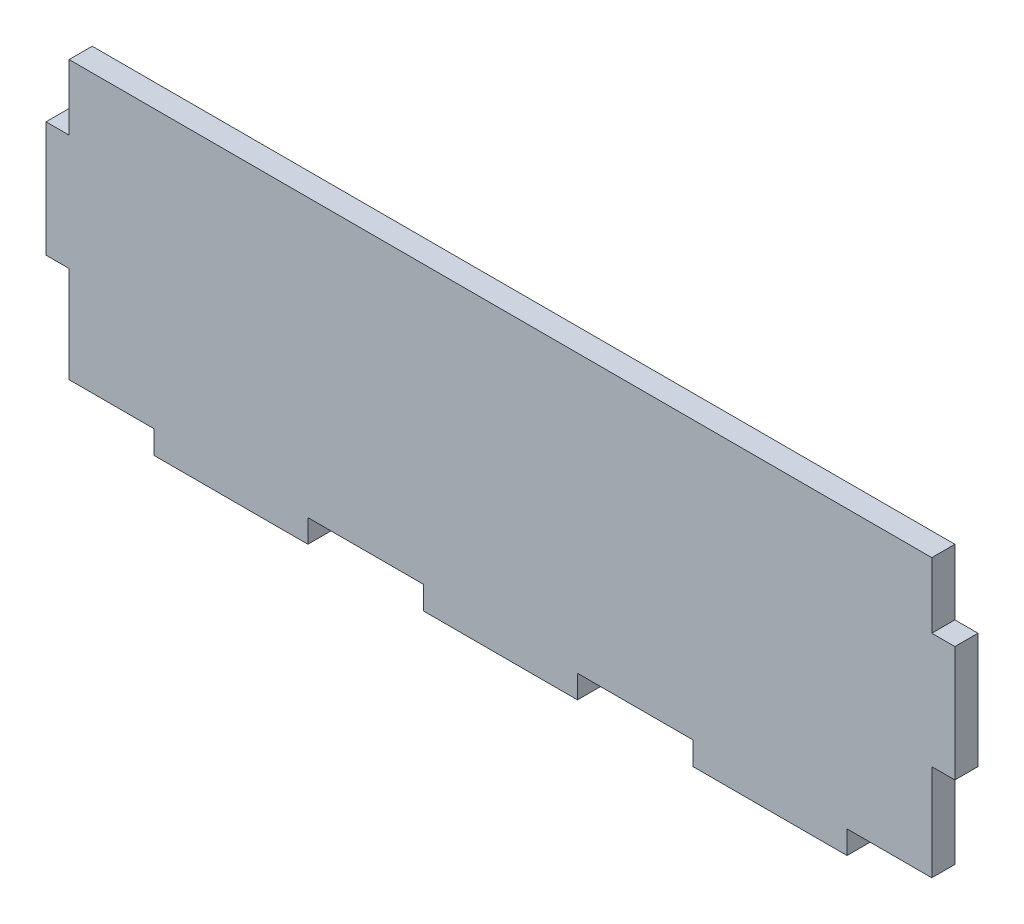
ISO-10303-21;
HEADER;
FILE_DESCRIPTION(('STEP AP214'),'2;1');
FILE_NAME('part.step','',(''),(''),'','','');
FILE_SCHEMA(('AUTOMOTIVE_DESIGN { 1 0 10303 214 1 1 1 1 }'));
ENDSEC;
DATA;
#1=APPLICATION_CONTEXT('core data for automotive mechanical design processes');
#2=APPLICATION_PROTOCOL_DEFINITION('international standard','automotive_design',2000,#1);
#3=PRODUCT_CONTEXT('',#1,'mechanical');
#4=PRODUCT('Part','Part','',(#3));
#5=PRODUCT_RELATED_PRODUCT_CATEGORY('part','',(#4));
#6=PRODUCT_DEFINITION_FORMATION('','',#4);
#7=PRODUCT_DEFINITION_CONTEXT('part definition',#1,'design');
#8=PRODUCT_DEFINITION('design','',#6,#7);
#9=PRODUCT_DEFINITION_SHAPE('','',#8);
#10=(LENGTH_UNIT() NAMED_UNIT(*) SI_UNIT(.MILLI.,.METRE.));
#11=(NAMED_UNIT(*) PLANE_ANGLE_UNIT() SI_UNIT($,.RADIAN.));
#12=(NAMED_UNIT(*) SI_UNIT($,.STERADIAN.) SOLID_ANGLE_UNIT());
#13=UNCERTAINTY_MEASURE_WITH_UNIT(LENGTH_MEASURE(1.E-05),#10,'distance_accuracy_value','');
#14=(GEOMETRIC_REPRESENTATION_CONTEXT(3) GLOBAL_UNCERTAINTY_ASSIGNED_CONTEXT((#13)) GLOBAL_UNIT_ASSIGNED_CONTEXT((#10,
#11,#12)) REPRESENTATION_CONTEXT('',''));
#15=CARTESIAN_POINT('',(0.,0.,0.));
#16=DIRECTION('',(0.,0.,1.));
#17=DIRECTION('',(1.,0.,0.));
#18=AXIS2_PLACEMENT_3D('',#15,#16,#17);
#19=CARTESIAN_POINT('',(-59.,0.,3.));
#20=DIRECTION('',(1.,0.,0.));
#21=DIRECTION('',(0.,0.,-1.));
#22=AXIS2_PLACEMENT_3D('',#19,#20,#21);
#23=PLANE('',#22);
#24=DIRECTION('',(0.,-1.,0.));
#25=VECTOR('',#24,1.);
#26=CARTESIAN_POINT('',(-59.,0.,0.));
#27=LINE('',#26,#25);
#28=CARTESIAN_POINT('',(-59.,7.49999999999999,0.));
#29=VERTEX_POINT('',#28);
#30=CARTESIAN_POINT('',(-59.,-7.50000000000001,0.));
#31=VERTEX_POINT('',#30);
#32=EDGE_CURVE('E375',#29,#31,#27,.T.);
#33=ORIENTED_EDGE('',*,*,#32,.T.);
#34=DIRECTION('',(0.,0.,-1.));
#35=VECTOR('',#34,1.);
#36=CARTESIAN_POINT('',(-59.,-7.50000000000001,3.));
#37=LINE('',#36,#35);
#38=CARTESIAN_POINT('',(-59.,-7.50000000000001,3.));
#39=VERTEX_POINT('',#38);
#40=EDGE_CURVE('E11',#39,#31,#37,.T.);
#41=ORIENTED_EDGE('',*,*,#40,.F.);
#42=DIRECTION('',(0.,-1.,0.));
#43=VECTOR('',#42,1.);
#44=CARTESIAN_POINT('',(-59.,0.,3.));
#45=LINE('',#44,#43);
#46=CARTESIAN_POINT('',(-59.,7.49999999999999,3.));
#47=VERTEX_POINT('',#46);
#48=EDGE_CURVE('E397',#47,#39,#45,.T.);
#49=ORIENTED_EDGE('',*,*,#48,.F.);
#50=DIRECTION('',(0.,0.,-1.));
#51=VECTOR('',#50,1.);
#52=CARTESIAN_POINT('',(-59.,7.49999999999999,3.));
#53=LINE('',#52,#51);
#54=EDGE_CURVE('E68',#47,#29,#53,.T.);
#55=ORIENTED_EDGE('',*,*,#54,.T.);
#56=EDGE_LOOP('',(#33,#41,#49,#55));
#57=FACE_BOUND('',#56,.T.);
#58=ADVANCED_FACE('F44',(#57),#23,.F.);
#59=CARTESIAN_POINT('',(0.,-7.50000000000001,3.));
#60=DIRECTION('',(0.,1.,0.));
#61=DIRECTION('',(0.,0.,1.));
#62=AXIS2_PLACEMENT_3D('',#59,#60,#61);
#63=PLANE('',#62);
#64=DIRECTION('',(1.,0.,0.));
#65=VECTOR('',#64,1.);
#66=CARTESIAN_POINT('',(0.,-7.50000000000001,0.));
#67=LINE('',#66,#65);
#68=CARTESIAN_POINT('',(-56.,-7.50000000000001,0.));
#69=VERTEX_POINT('',#68);
#70=EDGE_CURVE('E370',#31,#69,#67,.T.);
#71=ORIENTED_EDGE('',*,*,#70,.T.);
#72=DIRECTION('',(0.,0.,-1.));
#73=VECTOR('',#72,1.);
#74=CARTESIAN_POINT('',(-56.,-7.50000000000001,3.));
#75=LINE('',#74,#73);
#76=CARTESIAN_POINT('',(-56.,-7.50000000000001,3.));
#77=VERTEX_POINT('',#76);
#78=EDGE_CURVE('E52',#77,#69,#75,.T.);
#79=ORIENTED_EDGE('',*,*,#78,.F.);
#80=DIRECTION('',(1.,0.,0.));
#81=VECTOR('',#80,1.);
#82=CARTESIAN_POINT('',(0.,-7.50000000000001,3.));
#83=LINE('',#82,#81);
#84=EDGE_CURVE('E149',#39,#77,#83,.T.);
#85=ORIENTED_EDGE('',*,*,#84,.F.);
#86=ORIENTED_EDGE('',*,*,#40,.T.);
#87=EDGE_LOOP('',(#71,#79,#85,#86));
#88=FACE_BOUND('',#87,.T.);
#89=ADVANCED_FACE('F371',(#88),#63,.F.);
#90=CARTESIAN_POINT('',(-56.,0.,3.));
#91=DIRECTION('',(-1.,0.,0.));
#92=DIRECTION('',(0.,0.,1.));
#93=AXIS2_PLACEMENT_3D('',#90,#91,#92);
#94=PLANE('',#93);
#95=DIRECTION('',(0.,1.,0.));
#96=VECTOR('',#95,1.);
#97=CARTESIAN_POINT('',(-56.,0.,0.));
#98=LINE('',#97,#96);
#99=CARTESIAN_POINT('',(-56.,-20.,0.));
#100=VERTEX_POINT('',#99);
#101=EDGE_CURVE('E367',#100,#69,#98,.T.);
#102=ORIENTED_EDGE('',*,*,#101,.F.);
#103=DIRECTION('',(0.,0.,-1.));
#104=VECTOR('',#103,1.);
#105=CARTESIAN_POINT('',(-56.,-20.,3.));
#106=LINE('',#105,#104);
#107=CARTESIAN_POINT('',(-56.,-20.,3.));
#108=VERTEX_POINT('',#107);
#109=EDGE_CURVE('E359',#108,#100,#106,.T.);
#110=ORIENTED_EDGE('',*,*,#109,.F.);
#111=DIRECTION('',(0.,1.,0.));
#112=VECTOR('',#111,1.);
#113=CARTESIAN_POINT('',(-56.,0.,3.));
#114=LINE('',#113,#112);
#115=EDGE_CURVE('E244',#108,#77,#114,.T.);
#116=ORIENTED_EDGE('',*,*,#115,.T.);
#117=ORIENTED_EDGE('',*,*,#78,.T.);
#118=EDGE_LOOP('',(#102,#110,#116,#117));
#119=FACE_BOUND('',#118,.T.);
#120=ADVANCED_FACE('F365',(#119),#94,.T.);
#121=CARTESIAN_POINT('',(0.,-20.,3.));
#122=DIRECTION('',(0.,-1.,0.));
#123=DIRECTION('',(1.,0.,0.));
#124=AXIS2_PLACEMENT_3D('',#121,#122,#123);
#125=PLANE('',#124);
#126=DIRECTION('',(-1.,0.,0.));
#127=VECTOR('',#126,1.);
#128=CARTESIAN_POINT('',(0.,-20.,0.));
#129=LINE('',#128,#127);
#130=CARTESIAN_POINT('',(-45.,-20.,0.));
#131=VERTEX_POINT('',#130);
#132=EDGE_CURVE('E381',#131,#100,#129,.T.);
#133=ORIENTED_EDGE('',*,*,#132,.F.);
#134=DIRECTION('',(0.,0.,-1.));
#135=VECTOR('',#134,1.);
#136=CARTESIAN_POINT('',(-45.,-20.,3.));
#137=LINE('',#136,#135);
#138=CARTESIAN_POINT('',(-45.,-20.,3.));
#139=VERTEX_POINT('',#138);
#140=EDGE_CURVE('E356',#139,#131,#137,.T.);
#141=ORIENTED_EDGE('',*,*,#140,.F.);
#142=DIRECTION('',(-1.,0.,0.));
#143=VECTOR('',#142,1.);
#144=CARTESIAN_POINT('',(0.,-20.,3.));
#145=LINE('',#144,#143);
#146=EDGE_CURVE('E260',#139,#108,#145,.T.);
#147=ORIENTED_EDGE('',*,*,#146,.T.);
#148=ORIENTED_EDGE('',*,*,#109,.T.);
#149=EDGE_LOOP('',(#133,#141,#147,#148));
#150=FACE_BOUND('',#149,.T.);
#151=ADVANCED_FACE('F484',(#150),#125,.T.);
#152=CARTESIAN_POINT('',(-45.,0.,3.));
#153=DIRECTION('',(-1.,0.,0.));
#154=DIRECTION('',(0.,0.,1.));
#155=AXIS2_PLACEMENT_3D('',#152,#153,#154);
#156=PLANE('',#155);
#157=DIRECTION('',(0.,1.,0.));
#158=VECTOR('',#157,1.);
#159=CARTESIAN_POINT('',(-45.,0.,0.));
#160=LINE('',#159,#158);
#161=CARTESIAN_POINT('',(-45.,-23.,0.));
#162=VERTEX_POINT('',#161);
#163=EDGE_CURVE('E386',#162,#131,#160,.T.);
#164=ORIENTED_EDGE('',*,*,#163,.F.);
#165=DIRECTION('',(0.,0.,-1.));
#166=VECTOR('',#165,1.);
#167=CARTESIAN_POINT('',(-45.,-23.,3.));
#168=LINE('',#167,#166);
#169=CARTESIAN_POINT('',(-45.,-23.,3.));
#170=VERTEX_POINT('',#169);
#171=EDGE_CURVE('E353',#170,#162,#168,.T.);
#172=ORIENTED_EDGE('',*,*,#171,.F.);
#173=DIRECTION('',(0.,1.,0.));
#174=VECTOR('',#173,1.);
#175=CARTESIAN_POINT('',(-45.,0.,3.));
#176=LINE('',#175,#174);
#177=EDGE_CURVE('E272',#170,#139,#176,.T.);
#178=ORIENTED_EDGE('',*,*,#177,.T.);
#179=ORIENTED_EDGE('',*,*,#140,.T.);
#180=EDGE_LOOP('',(#164,#172,#178,#179));
#181=FACE_BOUND('',#180,.T.);
#182=ADVANCED_FACE('F494',(#181),#156,.T.);
#183=CARTESIAN_POINT('',(0.,-23.,3.));
#184=DIRECTION('',(0.,1.,0.));
#185=DIRECTION('',(0.,0.,1.));
#186=AXIS2_PLACEMENT_3D('',#183,#184,#185);
#187=PLANE('',#186);
#188=DIRECTION('',(1.,0.,0.));
#189=VECTOR('',#188,1.);
#190=CARTESIAN_POINT('',(0.,-23.,0.));
#191=LINE('',#190,#189);
#192=CARTESIAN_POINT('',(-25.,-23.,0.));
#193=VERTEX_POINT('',#192);
#194=EDGE_CURVE('E444',#162,#193,#191,.T.);
#195=ORIENTED_EDGE('',*,*,#194,.T.);
#196=DIRECTION('',(0.,0.,-1.));
#197=VECTOR('',#196,1.);
#198=CARTESIAN_POINT('',(-25.,-23.,3.));
#199=LINE('',#198,#197);
#200=CARTESIAN_POINT('',(-25.,-23.,3.));
#201=VERTEX_POINT('',#200);
#202=EDGE_CURVE('E349',#201,#193,#199,.T.);
#203=ORIENTED_EDGE('',*,*,#202,.F.);
#204=DIRECTION('',(1.,0.,0.));
#205=VECTOR('',#204,1.);
#206=CARTESIAN_POINT('',(0.,-23.,3.));
#207=LINE('',#206,#205);
#208=EDGE_CURVE('E278',#170,#201,#207,.T.);
#209=ORIENTED_EDGE('',*,*,#208,.F.);
#210=ORIENTED_EDGE('',*,*,#171,.T.);
#211=EDGE_LOOP('',(#195,#203,#209,#210));
#212=FACE_BOUND('',#211,.T.);
#213=ADVANCED_FACE('F541',(#212),#187,.F.);
#214=CARTESIAN_POINT('',(-25.,0.,3.));
#215=DIRECTION('',(-1.,0.,0.));
#216=DIRECTION('',(0.,0.,1.));
#217=AXIS2_PLACEMENT_3D('',#214,#215,#216);
#218=PLANE('',#217);
#219=DIRECTION('',(0.,1.,0.));
#220=VECTOR('',#219,1.);
#221=CARTESIAN_POINT('',(-25.,0.,0.));
#222=LINE('',#221,#220);
#223=CARTESIAN_POINT('',(-25.,-20.,0.));
#224=VERTEX_POINT('',#223);
#225=EDGE_CURVE('E436',#193,#224,#222,.T.);
#226=ORIENTED_EDGE('',*,*,#225,.T.);
#227=DIRECTION('',(0.,0.,-1.));
#228=VECTOR('',#227,1.);
#229=CARTESIAN_POINT('',(-25.,-20.,3.));
#230=LINE('',#229,#228);
#231=CARTESIAN_POINT('',(-25.,-20.,3.));
#232=VERTEX_POINT('',#231);
#233=EDGE_CURVE('E346',#232,#224,#230,.T.);
#234=ORIENTED_EDGE('',*,*,#233,.F.);
#235=DIRECTION('',(0.,1.,0.));
#236=VECTOR('',#235,1.);
#237=CARTESIAN_POINT('',(-25.,0.,3.));
#238=LINE('',#237,#236);
#239=EDGE_CURVE('E283',#201,#232,#238,.T.);
#240=ORIENTED_EDGE('',*,*,#239,.F.);
#241=ORIENTED_EDGE('',*,*,#202,.T.);
#242=EDGE_LOOP('',(#226,#234,#240,#241));
#243=FACE_BOUND('',#242,.T.);
#244=ADVANCED_FACE('F542',(#243),#218,.F.);
#245=CARTESIAN_POINT('',(-10.,-20.,0.));
#246=VERTEX_POINT('',#245);
#247=EDGE_CURVE('E389',#246,#224,#129,.T.);
#248=ORIENTED_EDGE('',*,*,#247,.F.);
#249=DIRECTION('',(0.,0.,-1.));
#250=VECTOR('',#249,1.);
#251=CARTESIAN_POINT('',(-10.,-20.,3.));
#252=LINE('',#251,#250);
#253=CARTESIAN_POINT('',(-10.,-20.,3.));
#254=VERTEX_POINT('',#253);
#255=EDGE_CURVE('E343',#254,#246,#252,.T.);
#256=ORIENTED_EDGE('',*,*,#255,.F.);
#257=EDGE_CURVE('E269',#254,#232,#145,.T.);
#258=ORIENTED_EDGE('',*,*,#257,.T.);
#259=ORIENTED_EDGE('',*,*,#233,.T.);
#260=EDGE_LOOP('',(#248,#256,#258,#259));
#261=FACE_BOUND('',#260,.T.);
#262=ADVANCED_FACE('F495',(#261),#125,.T.);
#263=CARTESIAN_POINT('',(-10.,0.,3.));
#264=DIRECTION('',(-1.,0.,0.));
#265=DIRECTION('',(0.,0.,1.));
#266=AXIS2_PLACEMENT_3D('',#263,#264,#265);
#267=PLANE('',#266);
#268=DIRECTION('',(0.,1.,0.));
#269=VECTOR('',#268,1.);
#270=CARTESIAN_POINT('',(-10.,0.,0.));
#271=LINE('',#270,#269);
#272=CARTESIAN_POINT('',(-10.,-23.,0.));
#273=VERTEX_POINT('',#272);
#274=EDGE_CURVE('E435',#273,#246,#271,.T.);
#275=ORIENTED_EDGE('',*,*,#274,.F.);
#276=DIRECTION('',(0.,0.,-1.));
#277=VECTOR('',#276,1.);
#278=CARTESIAN_POINT('',(-10.,-23.,3.));
#279=LINE('',#278,#277);
#280=CARTESIAN_POINT('',(-10.,-23.,3.));
#281=VERTEX_POINT('',#280);
#282=EDGE_CURVE('E340',#281,#273,#279,.T.);
#283=ORIENTED_EDGE('',*,*,#282,.F.);
#284=DIRECTION('',(0.,1.,0.));
#285=VECTOR('',#284,1.);
#286=CARTESIAN_POINT('',(-10.,0.,3.));
#287=LINE('',#286,#285);
#288=EDGE_CURVE('E282',#281,#254,#287,.T.);
#289=ORIENTED_EDGE('',*,*,#288,.T.);
#290=ORIENTED_EDGE('',*,*,#255,.T.);
#291=EDGE_LOOP('',(#275,#283,#289,#290));
#292=FACE_BOUND('',#291,.T.);
#293=ADVANCED_FACE('F546',(#292),#267,.T.);
#294=CARTESIAN_POINT('',(0.,-23.,3.));
#295=DIRECTION('',(0.,1.,0.));
#296=DIRECTION('',(0.,0.,1.));
#297=AXIS2_PLACEMENT_3D('',#294,#295,#296);
#298=PLANE('',#297);
#299=DIRECTION('',(1.,0.,0.));
#300=VECTOR('',#299,1.);
#301=CARTESIAN_POINT('',(0.,-23.,0.));
#302=LINE('',#301,#300);
#303=CARTESIAN_POINT('',(9.99999999999999,-23.,0.));
#304=VERTEX_POINT('',#303);
#305=EDGE_CURVE('E431',#273,#304,#302,.T.);
#306=ORIENTED_EDGE('',*,*,#305,.T.);
#307=DIRECTION('',(0.,0.,-1.));
#308=VECTOR('',#307,1.);
#309=CARTESIAN_POINT('',(9.99999999999999,-23.,3.));
#310=LINE('',#309,#308);
#311=CARTESIAN_POINT('',(9.99999999999999,-23.,3.));
#312=VERTEX_POINT('',#311);
#313=EDGE_CURVE('E336',#312,#304,#310,.T.);
#314=ORIENTED_EDGE('',*,*,#313,.F.);
#315=DIRECTION('',(1.,0.,0.));
#316=VECTOR('',#315,1.);
#317=CARTESIAN_POINT('',(0.,-23.,3.));
#318=LINE('',#317,#316);
#319=EDGE_CURVE('E289',#281,#312,#318,.T.);
#320=ORIENTED_EDGE('',*,*,#319,.F.);
#321=ORIENTED_EDGE('',*,*,#282,.T.);
#322=EDGE_LOOP('',(#306,#314,#320,#321));
#323=FACE_BOUND('',#322,.T.);
#324=ADVANCED_FACE('F553',(#323),#298,.F.);
#325=CARTESIAN_POINT('',(9.99999999999999,0.,3.));
#326=DIRECTION('',(-1.,0.,0.));
#327=DIRECTION('',(0.,0.,1.));
#328=AXIS2_PLACEMENT_3D('',#325,#326,#327);
#329=PLANE('',#328);
#330=DIRECTION('',(0.,1.,0.));
#331=VECTOR('',#330,1.);
#332=CARTESIAN_POINT('',(9.99999999999999,0.,0.));
#333=LINE('',#332,#331);
#334=CARTESIAN_POINT('',(9.99999999999999,-20.,0.));
#335=VERTEX_POINT('',#334);
#336=EDGE_CURVE('E425',#304,#335,#333,.T.);
#337=ORIENTED_EDGE('',*,*,#336,.T.);
#338=DIRECTION('',(0.,0.,-1.));
#339=VECTOR('',#338,1.);
#340=CARTESIAN_POINT('',(9.99999999999999,-20.,3.));
#341=LINE('',#340,#339);
#342=CARTESIAN_POINT('',(9.99999999999999,-20.,3.));
#343=VERTEX_POINT('',#342);
#344=EDGE_CURVE('E328',#343,#335,#341,.T.);
#345=ORIENTED_EDGE('',*,*,#344,.F.);
#346=DIRECTION('',(0.,1.,0.));
#347=VECTOR('',#346,1.);
#348=CARTESIAN_POINT('',(9.99999999999999,0.,3.));
#349=LINE('',#348,#347);
#350=EDGE_CURVE('E268',#312,#343,#349,.T.);
#351=ORIENTED_EDGE('',*,*,#350,.F.);
#352=ORIENTED_EDGE('',*,*,#313,.T.);
#353=EDGE_LOOP('',(#337,#345,#351,#352));
#354=FACE_BOUND('',#353,.T.);
#355=ADVANCED_FACE('F497',(#354),#329,.F.);
#356=CARTESIAN_POINT('',(25.,-20.,0.));
#357=VERTEX_POINT('',#356);
#358=EDGE_CURVE('E416',#357,#335,#129,.T.);
#359=ORIENTED_EDGE('',*,*,#358,.F.);
#360=DIRECTION('',(0.,0.,-1.));
#361=VECTOR('',#360,1.);
#362=CARTESIAN_POINT('',(25.,-20.,3.));
#363=LINE('',#362,#361);
#364=CARTESIAN_POINT('',(25.,-20.,3.));
#365=VERTEX_POINT('',#364);
#366=EDGE_CURVE('E319',#365,#357,#363,.T.);
#367=ORIENTED_EDGE('',*,*,#366,.F.);
#368=EDGE_CURVE('E259',#365,#343,#145,.T.);
#369=ORIENTED_EDGE('',*,*,#368,.T.);
#370=ORIENTED_EDGE('',*,*,#344,.T.);
#371=EDGE_LOOP('',(#359,#367,#369,#370));
#372=FACE_BOUND('',#371,.T.);
#373=ADVANCED_FACE('F485',(#372),#125,.T.);
#374=CARTESIAN_POINT('',(25.,0.,3.));
#375=DIRECTION('',(-1.,0.,0.));
#376=DIRECTION('',(0.,0.,1.));
#377=AXIS2_PLACEMENT_3D('',#374,#375,#376);
#378=PLANE('',#377);
#379=DIRECTION('',(0.,1.,0.));
#380=VECTOR('',#379,1.);
#381=CARTESIAN_POINT('',(25.,0.,0.));
#382=LINE('',#381,#380);
#383=CARTESIAN_POINT('',(25.,-23.,0.));
#384=VERTEX_POINT('',#383);
#385=EDGE_CURVE('E322',#384,#357,#382,.T.);
#386=ORIENTED_EDGE('',*,*,#385,.F.);
#387=DIRECTION('',(0.,0.,-1.));
#388=VECTOR('',#387,1.);
#389=CARTESIAN_POINT('',(25.,-23.,3.));
#390=LINE('',#389,#388);
#391=CARTESIAN_POINT('',(25.,-23.,3.));
#392=VERTEX_POINT('',#391);
#393=EDGE_CURVE('E310',#392,#384,#390,.T.);
#394=ORIENTED_EDGE('',*,*,#393,.F.);
#395=DIRECTION('',(0.,1.,0.));
#396=VECTOR('',#395,1.);
#397=CARTESIAN_POINT('',(25.,0.,3.));
#398=LINE('',#397,#396);
#399=EDGE_CURVE('E267',#392,#365,#398,.T.);
#400=ORIENTED_EDGE('',*,*,#399,.T.);
#401=ORIENTED_EDGE('',*,*,#366,.T.);
#402=EDGE_LOOP('',(#386,#394,#400,#401));
#403=FACE_BOUND('',#402,.T.);
#404=ADVANCED_FACE('F318',(#403),#378,.T.);
#405=CARTESIAN_POINT('',(0.,-23.,3.));
#406=DIRECTION('',(0.,-1.,0.));
#407=DIRECTION('',(0.,0.,-1.));
#408=AXIS2_PLACEMENT_3D('',#405,#406,#407);
#409=PLANE('',#408);
#410=DIRECTION('',(-1.,0.,0.));
#411=VECTOR('',#410,1.);
#412=CARTESIAN_POINT('',(0.,-23.,0.));
#413=LINE('',#412,#411);
#414=CARTESIAN_POINT('',(45.,-23.,0.));
#415=VERTEX_POINT('',#414);
#416=EDGE_CURVE('E421',#415,#384,#413,.T.);
#417=ORIENTED_EDGE('',*,*,#416,.F.);
#418=DIRECTION('',(0.,0.,-1.));
#419=VECTOR('',#418,1.);
#420=CARTESIAN_POINT('',(45.,-23.,3.));
#421=LINE('',#420,#419);
#422=CARTESIAN_POINT('',(45.,-23.,3.));
#423=VERTEX_POINT('',#422);
#424=EDGE_CURVE('E312',#423,#415,#421,.T.);
#425=ORIENTED_EDGE('',*,*,#424,.F.);
#426=DIRECTION('',(-1.,0.,0.));
#427=VECTOR('',#426,1.);
#428=CARTESIAN_POINT('',(0.,-23.,3.));
#429=LINE('',#428,#427);
#430=EDGE_CURVE('E263',#423,#392,#429,.T.);
#431=ORIENTED_EDGE('',*,*,#430,.T.);
#432=ORIENTED_EDGE('',*,*,#393,.T.);
#433=EDGE_LOOP('',(#417,#425,#431,#432));
#434=FACE_BOUND('',#433,.T.);
#435=ADVANCED_FACE('F309',(#434),#409,.T.);
#436=CARTESIAN_POINT('',(45.,0.,3.));
#437=DIRECTION('',(-1.,0.,0.));
#438=DIRECTION('',(0.,0.,1.));
#439=AXIS2_PLACEMENT_3D('',#436,#437,#438);
#440=PLANE('',#439);
#441=DIRECTION('',(0.,1.,0.));
#442=VECTOR('',#441,1.);
#443=CARTESIAN_POINT('',(45.,0.,0.));
#444=LINE('',#443,#442);
#445=CARTESIAN_POINT('',(45.,-20.,0.));
#446=VERTEX_POINT('',#445);
#447=EDGE_CURVE('E415',#415,#446,#444,.T.);
#448=ORIENTED_EDGE('',*,*,#447,.T.);
#449=DIRECTION('',(0.,0.,-1.));
#450=VECTOR('',#449,1.);
#451=CARTESIAN_POINT('',(45.,-20.,3.));
#452=LINE('',#451,#450);
#453=CARTESIAN_POINT('',(45.,-20.,3.));
#454=VERTEX_POINT('',#453);
#455=EDGE_CURVE('E330',#454,#446,#452,.T.);
#456=ORIENTED_EDGE('',*,*,#455,.F.);
#457=DIRECTION('',(0.,1.,0.));
#458=VECTOR('',#457,1.);
#459=CARTESIAN_POINT('',(45.,0.,3.));
#460=LINE('',#459,#458);
#461=EDGE_CURVE('E257',#423,#454,#460,.T.);
#462=ORIENTED_EDGE('',*,*,#461,.F.);
#463=ORIENTED_EDGE('',*,*,#424,.T.);
#464=EDGE_LOOP('',(#448,#456,#462,#463));
#465=FACE_BOUND('',#464,.T.);
#466=ADVANCED_FACE('F454',(#465),#440,.F.);
#467=CARTESIAN_POINT('',(56.,-20.,0.));
#468=VERTEX_POINT('',#467);
#469=EDGE_CURVE('E388',#468,#446,#129,.T.);
#470=ORIENTED_EDGE('',*,*,#469,.F.);
#471=DIRECTION('',(0.,0.,-1.));
#472=VECTOR('',#471,1.);
#473=CARTESIAN_POINT('',(56.,-20.,3.));
#474=LINE('',#473,#472);
#475=CARTESIAN_POINT('',(56.,-20.,3.));
#476=VERTEX_POINT('',#475);
#477=EDGE_CURVE('E456',#476,#468,#474,.T.);
#478=ORIENTED_EDGE('',*,*,#477,.F.);
#479=EDGE_CURVE('E249',#476,#454,#145,.T.);
#480=ORIENTED_EDGE('',*,*,#479,.T.);
#481=ORIENTED_EDGE('',*,*,#455,.T.);
#482=EDGE_LOOP('',(#470,#478,#480,#481));
#483=FACE_BOUND('',#482,.T.);
#484=ADVANCED_FACE('F481',(#483),#125,.T.);
#485=CARTESIAN_POINT('',(56.,0.,3.));
#486=DIRECTION('',(-1.,0.,0.));
#487=DIRECTION('',(0.,0.,1.));
#488=AXIS2_PLACEMENT_3D('',#485,#486,#487);
#489=PLANE('',#488);
#490=DIRECTION('',(0.,1.,0.));
#491=VECTOR('',#490,1.);
#492=CARTESIAN_POINT('',(56.,0.,0.));
#493=LINE('',#492,#491);
#494=CARTESIAN_POINT('',(56.,-7.50000000000001,0.));
#495=VERTEX_POINT('',#494);
#496=EDGE_CURVE('E400',#468,#495,#493,.T.);
#497=ORIENTED_EDGE('',*,*,#496,.T.);
#498=DIRECTION('',(0.,0.,-1.));
#499=VECTOR('',#498,1.);
#500=CARTESIAN_POINT('',(56.,-7.50000000000001,3.));
#501=LINE('',#500,#499);
#502=CARTESIAN_POINT('',(56.,-7.50000000000001,3.));
#503=VERTEX_POINT('',#502);
#504=EDGE_CURVE('E458',#503,#495,#501,.T.);
#505=ORIENTED_EDGE('',*,*,#504,.F.);
#506=DIRECTION('',(0.,1.,0.));
#507=VECTOR('',#506,1.);
#508=CARTESIAN_POINT('',(56.,0.,3.));
#509=LINE('',#508,#507);
#510=EDGE_CURVE('E239',#476,#503,#509,.T.);
#511=ORIENTED_EDGE('',*,*,#510,.F.);
#512=ORIENTED_EDGE('',*,*,#477,.T.);
#513=EDGE_LOOP('',(#497,#505,#511,#512));
#514=FACE_BOUND('',#513,.T.);
#515=ADVANCED_FACE('F480',(#514),#489,.F.);
#516=CARTESIAN_POINT('',(0.,-7.50000000000001,3.));
#517=DIRECTION('',(0.,-1.,0.));
#518=DIRECTION('',(0.,0.,-1.));
#519=AXIS2_PLACEMENT_3D('',#516,#517,#518);
#520=PLANE('',#519);
#521=DIRECTION('',(-1.,0.,0.));
#522=VECTOR('',#521,1.);
#523=CARTESIAN_POINT('',(0.,-7.50000000000001,0.));
#524=LINE('',#523,#522);
#525=CARTESIAN_POINT('',(59.,-7.50000000000001,0.));
#526=VERTEX_POINT('',#525);
#527=EDGE_CURVE('E408',#526,#495,#524,.T.);
#528=ORIENTED_EDGE('',*,*,#527,.F.);
#529=DIRECTION('',(0.,0.,-1.));
#530=VECTOR('',#529,1.);
#531=CARTESIAN_POINT('',(59.,-7.50000000000001,3.));
#532=LINE('',#531,#530);
#533=CARTESIAN_POINT('',(59.,-7.50000000000001,3.));
#534=VERTEX_POINT('',#533);
#535=EDGE_CURVE('E463',#534,#526,#532,.T.);
#536=ORIENTED_EDGE('',*,*,#535,.F.);
#537=DIRECTION('',(-1.,0.,0.));
#538=VECTOR('',#537,1.);
#539=CARTESIAN_POINT('',(0.,-7.50000000000001,3.));
#540=LINE('',#539,#538);
#541=EDGE_CURVE('E248',#534,#503,#540,.T.);
#542=ORIENTED_EDGE('',*,*,#541,.T.);
#543=ORIENTED_EDGE('',*,*,#504,.T.);
#544=EDGE_LOOP('',(#528,#536,#542,#543));
#545=FACE_BOUND('',#544,.T.);
#546=ADVANCED_FACE('F479',(#545),#520,.T.);
#547=CARTESIAN_POINT('',(59.,0.,3.));
#548=DIRECTION('',(1.,0.,0.));
#549=DIRECTION('',(0.,0.,-1.));
#550=AXIS2_PLACEMENT_3D('',#547,#548,#549);
#551=PLANE('',#550);
#552=DIRECTION('',(0.,-1.,0.));
#553=VECTOR('',#552,1.);
#554=CARTESIAN_POINT('',(59.,0.,0.));
#555=LINE('',#554,#553);
#556=CARTESIAN_POINT('',(59.,7.49999999999999,0.));
#557=VERTEX_POINT('',#556);
#558=EDGE_CURVE('E402',#557,#526,#555,.T.);
#559=ORIENTED_EDGE('',*,*,#558,.F.);
#560=DIRECTION('',(0.,0.,-1.));
#561=VECTOR('',#560,1.);
#562=CARTESIAN_POINT('',(59.,7.49999999999999,3.));
#563=LINE('',#562,#561);
#564=CARTESIAN_POINT('',(59.,7.49999999999999,3.));
#565=VERTEX_POINT('',#564);
#566=EDGE_CURVE('E232',#565,#557,#563,.T.);
#567=ORIENTED_EDGE('',*,*,#566,.F.);
#568=DIRECTION('',(0.,-1.,0.));
#569=VECTOR('',#568,1.);
#570=CARTESIAN_POINT('',(59.,0.,3.));
#571=LINE('',#570,#569);
#572=EDGE_CURVE('E219',#565,#534,#571,.T.);
#573=ORIENTED_EDGE('',*,*,#572,.T.);
#574=ORIENTED_EDGE('',*,*,#535,.T.);
#575=EDGE_LOOP('',(#559,#567,#573,#574));
#576=FACE_BOUND('',#575,.T.);
#577=ADVANCED_FACE('F477',(#576),#551,.T.);
#578=CARTESIAN_POINT('',(0.,7.49999999999999,3.));
#579=DIRECTION('',(0.,-1.,0.));
#580=DIRECTION('',(0.,0.,-1.));
#581=AXIS2_PLACEMENT_3D('',#578,#579,#580);
#582=PLANE('',#581);
#583=DIRECTION('',(-1.,0.,0.));
#584=VECTOR('',#583,1.);
#585=CARTESIAN_POINT('',(0.,7.49999999999999,0.));
#586=LINE('',#585,#584);
#587=CARTESIAN_POINT('',(56.,7.49999999999999,0.));
#588=VERTEX_POINT('',#587);
#589=EDGE_CURVE('E227',#557,#588,#586,.T.);
#590=ORIENTED_EDGE('',*,*,#589,.T.);
#591=DIRECTION('',(0.,0.,-1.));
#592=VECTOR('',#591,1.);
#593=CARTESIAN_POINT('',(56.,7.49999999999999,3.));
#594=LINE('',#593,#592);
#595=CARTESIAN_POINT('',(56.,7.49999999999999,3.));
#596=VERTEX_POINT('',#595);
#597=EDGE_CURVE('E224',#596,#588,#594,.T.);
#598=ORIENTED_EDGE('',*,*,#597,.F.);
#599=DIRECTION('',(-1.,0.,0.));
#600=VECTOR('',#599,1.);
#601=CARTESIAN_POINT('',(0.,7.49999999999999,3.));
#602=LINE('',#601,#600);
#603=EDGE_CURVE('E211',#565,#596,#602,.T.);
#604=ORIENTED_EDGE('',*,*,#603,.F.);
#605=ORIENTED_EDGE('',*,*,#566,.T.);
#606=EDGE_LOOP('',(#590,#598,#604,#605));
#607=FACE_BOUND('',#606,.T.);
#608=ADVANCED_FACE('F225',(#607),#582,.F.);
#609=CARTESIAN_POINT('',(56.,16.,0.));
#610=VERTEX_POINT('',#609);
#611=EDGE_CURVE('E392',#588,#610,#493,.T.);
#612=ORIENTED_EDGE('',*,*,#611,.T.);
#613=DIRECTION('',(0.,0.,1.));
#614=VECTOR('',#613,1.);
#615=CARTESIAN_POINT('',(56.,16.,0.));
#616=LINE('',#615,#614);
#617=CARTESIAN_POINT('',(56.,16.,3.));
#618=VERTEX_POINT('',#617);
#619=EDGE_CURVE('E59',#610,#618,#616,.T.);
#620=ORIENTED_EDGE('',*,*,#619,.T.);
#621=EDGE_CURVE('E216',#596,#618,#509,.T.);
#622=ORIENTED_EDGE('',*,*,#621,.F.);
#623=ORIENTED_EDGE('',*,*,#597,.T.);
#624=EDGE_LOOP('',(#612,#620,#622,#623));
#625=FACE_BOUND('',#624,.T.);
#626=ADVANCED_FACE('F235',(#625),#489,.F.);
#627=DIRECTION('',(0.,0.,1.));
#628=VECTOR('',#627,1.);
#629=CARTESIAN_POINT('',(-56.,16.,0.));
#630=LINE('',#629,#628);
#631=CARTESIAN_POINT('',(-56.,16.,0.));
#632=VERTEX_POINT('',#631);
#633=CARTESIAN_POINT('',(-56.,16.,3.));
#634=VERTEX_POINT('',#633);
#635=EDGE_CURVE('E506',#632,#634,#630,.T.);
#636=ORIENTED_EDGE('',*,*,#635,.F.);
#637=CARTESIAN_POINT('',(-56.,7.49999999999999,0.));
#638=VERTEX_POINT('',#637);
#639=EDGE_CURVE('E384',#638,#632,#98,.T.);
#640=ORIENTED_EDGE('',*,*,#639,.F.);
#641=DIRECTION('',(0.,0.,-1.));
#642=VECTOR('',#641,1.);
#643=CARTESIAN_POINT('',(-56.,7.49999999999999,3.));
#644=LINE('',#643,#642);
#645=CARTESIAN_POINT('',(-56.,7.49999999999999,3.));
#646=VERTEX_POINT('',#645);
#647=EDGE_CURVE('E233',#646,#638,#644,.T.);
#648=ORIENTED_EDGE('',*,*,#647,.F.);
#649=EDGE_CURVE('E237',#646,#634,#114,.T.);
#650=ORIENTED_EDGE('',*,*,#649,.T.);
#651=EDGE_LOOP('',(#636,#640,#648,#650));
#652=FACE_BOUND('',#651,.T.);
#653=ADVANCED_FACE('F519',(#652),#94,.T.);
#654=CARTESIAN_POINT('',(0.,7.49999999999999,3.));
#655=DIRECTION('',(0.,1.,0.));
#656=DIRECTION('',(0.,0.,1.));
#657=AXIS2_PLACEMENT_3D('',#654,#655,#656);
#658=PLANE('',#657);
#659=DIRECTION('',(1.,0.,0.));
#660=VECTOR('',#659,1.);
#661=CARTESIAN_POINT('',(0.,7.49999999999999,0.));
#662=LINE('',#661,#660);
#663=EDGE_CURVE('E391',#29,#638,#662,.T.);
#664=ORIENTED_EDGE('',*,*,#663,.F.);
#665=ORIENTED_EDGE('',*,*,#54,.F.);
#666=DIRECTION('',(1.,0.,0.));
#667=VECTOR('',#666,1.);
#668=CARTESIAN_POINT('',(0.,7.49999999999999,3.));
#669=LINE('',#668,#667);
#670=EDGE_CURVE('E242',#47,#646,#669,.T.);
#671=ORIENTED_EDGE('',*,*,#670,.T.);
#672=ORIENTED_EDGE('',*,*,#647,.T.);
#673=EDGE_LOOP('',(#664,#665,#671,#672));
#674=FACE_BOUND('',#673,.T.);
#675=ADVANCED_FACE('F513',(#674),#658,.T.);
#676=CARTESIAN_POINT('',(0.,0.,3.));
#677=DIRECTION('',(0.,0.,1.));
#678=DIRECTION('',(1.,0.,0.));
#679=AXIS2_PLACEMENT_3D('',#676,#677,#678);
#680=PLANE('',#679);
#681=DIRECTION('',(1.,0.,0.));
#682=VECTOR('',#681,1.);
#683=CARTESIAN_POINT('',(-56.,16.,3.));
#684=LINE('',#683,#682);
#685=EDGE_CURVE('E516',#634,#618,#684,.T.);
#686=ORIENTED_EDGE('',*,*,#685,.F.);
#687=ORIENTED_EDGE('',*,*,#649,.F.);
#688=ORIENTED_EDGE('',*,*,#670,.F.);
#689=ORIENTED_EDGE('',*,*,#48,.T.);
#690=ORIENTED_EDGE('',*,*,#84,.T.);
#691=ORIENTED_EDGE('',*,*,#115,.F.);
#692=ORIENTED_EDGE('',*,*,#146,.F.);
#693=ORIENTED_EDGE('',*,*,#177,.F.);
#694=ORIENTED_EDGE('',*,*,#208,.T.);
#695=ORIENTED_EDGE('',*,*,#239,.T.);
#696=ORIENTED_EDGE('',*,*,#257,.F.);
#697=ORIENTED_EDGE('',*,*,#288,.F.);
#698=ORIENTED_EDGE('',*,*,#319,.T.);
#699=ORIENTED_EDGE('',*,*,#350,.T.);
#700=ORIENTED_EDGE('',*,*,#368,.F.);
#701=ORIENTED_EDGE('',*,*,#399,.F.);
#702=ORIENTED_EDGE('',*,*,#430,.F.);
#703=ORIENTED_EDGE('',*,*,#461,.T.);
#704=ORIENTED_EDGE('',*,*,#479,.F.);
#705=ORIENTED_EDGE('',*,*,#510,.T.);
#706=ORIENTED_EDGE('',*,*,#541,.F.);
#707=ORIENTED_EDGE('',*,*,#572,.F.);
#708=ORIENTED_EDGE('',*,*,#603,.T.);
#709=ORIENTED_EDGE('',*,*,#621,.T.);
#710=EDGE_LOOP('',(#686,#687,#688,#689,#690,#691,#692,#693,#694,#695,#696,#697,#698,#699,#700,
#701,#702,#703,#704,#705,#706,#707,#708,#709));
#711=FACE_BOUND('',#710,.T.);
#712=ADVANCED_FACE('F214',(#711),#680,.T.);
#713=CARTESIAN_POINT('',(0.,0.,0.));
#714=DIRECTION('',(0.,0.,1.));
#715=DIRECTION('',(1.,0.,0.));
#716=AXIS2_PLACEMENT_3D('',#713,#714,#715);
#717=PLANE('',#716);
#718=ORIENTED_EDGE('',*,*,#639,.T.);
#719=DIRECTION('',(1.,0.,0.));
#720=VECTOR('',#719,1.);
#721=CARTESIAN_POINT('',(-56.,16.,0.));
#722=LINE('',#721,#720);
#723=EDGE_CURVE('E522',#632,#610,#722,.T.);
#724=ORIENTED_EDGE('',*,*,#723,.T.);
#725=ORIENTED_EDGE('',*,*,#611,.F.);
#726=ORIENTED_EDGE('',*,*,#589,.F.);
#727=ORIENTED_EDGE('',*,*,#558,.T.);
#728=ORIENTED_EDGE('',*,*,#527,.T.);
#729=ORIENTED_EDGE('',*,*,#496,.F.);
#730=ORIENTED_EDGE('',*,*,#469,.T.);
#731=ORIENTED_EDGE('',*,*,#447,.F.);
#732=ORIENTED_EDGE('',*,*,#416,.T.);
#733=ORIENTED_EDGE('',*,*,#385,.T.);
#734=ORIENTED_EDGE('',*,*,#358,.T.);
#735=ORIENTED_EDGE('',*,*,#336,.F.);
#736=ORIENTED_EDGE('',*,*,#305,.F.);
#737=ORIENTED_EDGE('',*,*,#274,.T.);
#738=ORIENTED_EDGE('',*,*,#247,.T.);
#739=ORIENTED_EDGE('',*,*,#225,.F.);
#740=ORIENTED_EDGE('',*,*,#194,.F.);
#741=ORIENTED_EDGE('',*,*,#163,.T.);
#742=ORIENTED_EDGE('',*,*,#132,.T.);
#743=ORIENTED_EDGE('',*,*,#101,.T.);
#744=ORIENTED_EDGE('',*,*,#70,.F.);
#745=ORIENTED_EDGE('',*,*,#32,.F.);
#746=ORIENTED_EDGE('',*,*,#663,.T.);
#747=EDGE_LOOP('',(#718,#724,#725,#726,#727,#728,#729,#730,#731,#732,#733,#734,#735,#736,#737,
#738,#739,#740,#741,#742,#743,#744,#745,#746));
#748=FACE_BOUND('',#747,.T.);
#749=ADVANCED_FACE('F378',(#748),#717,.F.);
#750=CARTESIAN_POINT('',(-56.,16.,0.));
#751=DIRECTION('',(0.,-1.,0.));
#752=DIRECTION('',(0.,0.,-1.));
#753=AXIS2_PLACEMENT_3D('',#750,#751,#752);
#754=PLANE('',#753);
#755=ORIENTED_EDGE('',*,*,#685,.T.);
#756=ORIENTED_EDGE('',*,*,#619,.F.);
#757=ORIENTED_EDGE('',*,*,#723,.F.);
#758=ORIENTED_EDGE('',*,*,#635,.T.);
#759=EDGE_LOOP('',(#755,#756,#757,#758));
#760=FACE_BOUND('',#759,.T.);
#761=ADVANCED_FACE('F523',(#760),#754,.F.);
#762=CLOSED_SHELL('',(#58,#89,#120,#151,#182,#213,#244,#262,#293,#324,#355,#373,#404,#435,#466,
#484,#515,#546,#577,#608,#626,#653,#675,#712,#749,#761));
#763=MANIFOLD_SOLID_BREP('B2',#762);
#764=ADVANCED_BREP_SHAPE_REPRESENTATION('',(#18,#763),#14);
#765=SHAPE_DEFINITION_REPRESENTATION(#9,#764);
ENDSEC;
END-ISO-10303-21;
